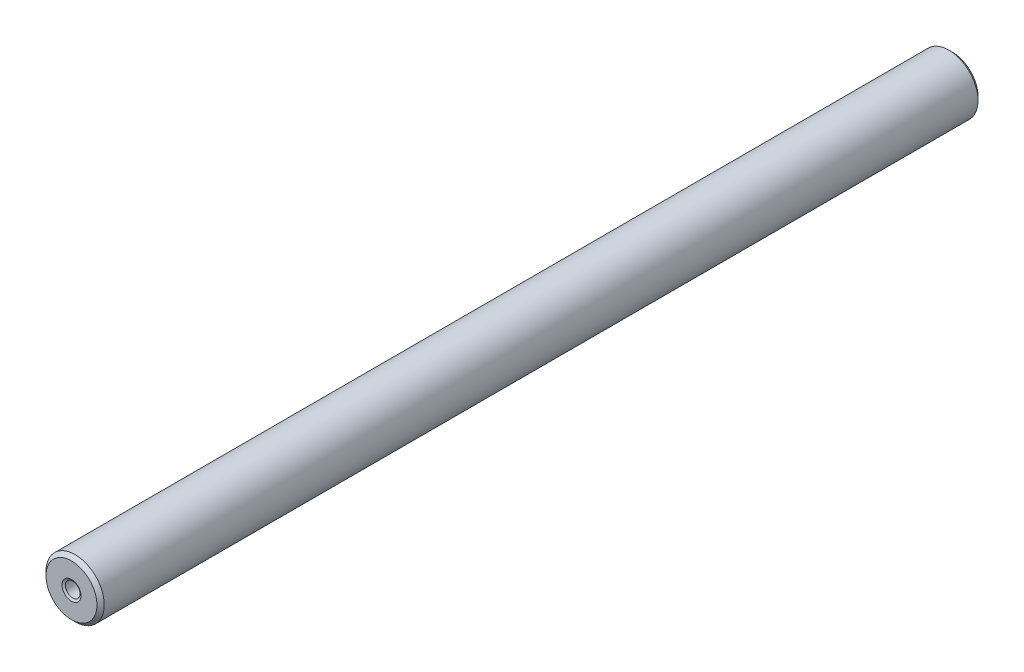
ISO-10303-21;
HEADER;
FILE_DESCRIPTION(('STEP AP214'),'2;1');
FILE_NAME('part.step','',(''),(''),'','','');
FILE_SCHEMA(('AUTOMOTIVE_DESIGN { 1 0 10303 214 1 1 1 1 }'));
ENDSEC;
DATA;
#1=APPLICATION_CONTEXT('core data for automotive mechanical design processes');
#2=APPLICATION_PROTOCOL_DEFINITION('international standard','automotive_design',2000,#1);
#3=PRODUCT_CONTEXT('',#1,'mechanical');
#4=PRODUCT('Part','Part','',(#3));
#5=PRODUCT_RELATED_PRODUCT_CATEGORY('part','',(#4));
#6=PRODUCT_DEFINITION_FORMATION('','',#4);
#7=PRODUCT_DEFINITION_CONTEXT('part definition',#1,'design');
#8=PRODUCT_DEFINITION('design','',#6,#7);
#9=PRODUCT_DEFINITION_SHAPE('','',#8);
#10=(LENGTH_UNIT() NAMED_UNIT(*) SI_UNIT(.MILLI.,.METRE.));
#11=(NAMED_UNIT(*) PLANE_ANGLE_UNIT() SI_UNIT($,.RADIAN.));
#12=(NAMED_UNIT(*) SI_UNIT($,.STERADIAN.) SOLID_ANGLE_UNIT());
#13=UNCERTAINTY_MEASURE_WITH_UNIT(LENGTH_MEASURE(1.E-05),#10,'distance_accuracy_value','');
#14=(GEOMETRIC_REPRESENTATION_CONTEXT(3) GLOBAL_UNCERTAINTY_ASSIGNED_CONTEXT((#13)) GLOBAL_UNIT_ASSIGNED_CONTEXT((#10,
#11,#12)) REPRESENTATION_CONTEXT('',''));
#15=CARTESIAN_POINT('',(0.,0.,0.));
#16=DIRECTION('',(0.,0.,1.));
#17=DIRECTION('',(1.,0.,0.));
#18=AXIS2_PLACEMENT_3D('',#15,#16,#17);
#19=CARTESIAN_POINT('',(0.,0.,119.));
#20=DIRECTION('',(0.,0.,1.));
#21=DIRECTION('',(1.,0.,0.));
#22=AXIS2_PLACEMENT_3D('',#19,#20,#21);
#23=CYLINDRICAL_SURFACE('',#22,1.);
#24=CARTESIAN_POINT('',(0.,0.,1.8267949192431));
#25=DIRECTION('',(0.,0.,1.));
#26=DIRECTION('',(1.,0.,0.));
#27=AXIS2_PLACEMENT_3D('',#24,#25,#26);
#28=CIRCLE('',#27,1.);
#29=CARTESIAN_POINT('',(1.,0.,1.8267949192431));
#30=VERTEX_POINT('',#29);
#31=EDGE_CURVE('E56',#30,#30,#28,.T.);
#32=ORIENTED_EDGE('',*,*,#31,.T.);
#33=EDGE_LOOP('',(#32));
#34=FACE_BOUND('',#33,.T.);
#35=CARTESIAN_POINT('',(0.,0.,0.299999999999981));
#36=DIRECTION('',(0.,0.,1.));
#37=DIRECTION('',(1.,0.,0.));
#38=AXIS2_PLACEMENT_3D('',#35,#36,#37);
#39=CIRCLE('',#38,1.);
#40=CARTESIAN_POINT('',(1.,0.,0.299999999999981));
#41=VERTEX_POINT('',#40);
#42=EDGE_CURVE('E59',#41,#41,#39,.F.);
#43=ORIENTED_EDGE('',*,*,#42,.T.);
#44=EDGE_LOOP('',(#43));
#45=FACE_BOUND('',#44,.T.);
#46=ADVANCED_FACE('F30',(#34,#45),#23,.F.);
#47=CARTESIAN_POINT('',(-1.,0.,0.));
#48=DIRECTION('',(0.,0.,1.));
#49=DIRECTION('',(1.,0.,0.));
#50=AXIS2_PLACEMENT_3D('',#47,#48,#49);
#51=PLANE('',#50);
#52=CARTESIAN_POINT('',(0.,0.,0.));
#53=DIRECTION('',(0.,0.,1.));
#54=DIRECTION('',(1.,0.,0.));
#55=AXIS2_PLACEMENT_3D('',#52,#53,#54);
#56=CIRCLE('',#55,1.17320508075687);
#57=CARTESIAN_POINT('',(1.17320508075687,0.,0.));
#58=VERTEX_POINT('',#57);
#59=EDGE_CURVE('E50',#58,#58,#56,.T.);
#60=ORIENTED_EDGE('',*,*,#59,.T.);
#61=EDGE_LOOP('',(#60));
#62=FACE_BOUND('',#61,.T.);
#63=CARTESIAN_POINT('',(0.,0.,0.));
#64=DIRECTION('',(0.,0.,1.));
#65=DIRECTION('',(1.,0.,0.));
#66=AXIS2_PLACEMENT_3D('',#63,#64,#65);
#67=CIRCLE('',#66,3.50000000000002);
#68=CARTESIAN_POINT('',(3.50000000000002,0.,0.));
#69=VERTEX_POINT('',#68);
#70=EDGE_CURVE('E65',#69,#69,#67,.F.);
#71=ORIENTED_EDGE('',*,*,#70,.T.);
#72=EDGE_LOOP('',(#71));
#73=FACE_BOUND('',#72,.T.);
#74=ADVANCED_FACE('F95',(#62,#73),#51,.F.);
#75=CARTESIAN_POINT('',(0.,0.,119.));
#76=DIRECTION('',(0.,0.,1.));
#77=DIRECTION('',(1.,0.,0.));
#78=AXIS2_PLACEMENT_3D('',#75,#76,#77);
#79=CYLINDRICAL_SURFACE('',#78,4.);
#80=CARTESIAN_POINT('',(0.,0.,0.499999999999973));
#81=DIRECTION('',(0.,0.,1.));
#82=DIRECTION('',(1.,0.,0.));
#83=AXIS2_PLACEMENT_3D('',#80,#81,#82);
#84=CIRCLE('',#83,4.);
#85=CARTESIAN_POINT('',(4.,0.,0.499999999999972));
#86=VERTEX_POINT('',#85);
#87=EDGE_CURVE('E68',#86,#86,#84,.T.);
#88=ORIENTED_EDGE('',*,*,#87,.T.);
#89=EDGE_LOOP('',(#88));
#90=FACE_BOUND('',#89,.T.);
#91=CARTESIAN_POINT('',(0.,0.,120.5));
#92=DIRECTION('',(0.,0.,-1.));
#93=DIRECTION('',(-1.,0.,0.));
#94=AXIS2_PLACEMENT_3D('',#91,#92,#93);
#95=CIRCLE('',#94,4.);
#96=CARTESIAN_POINT('',(-3.99999999999999,0.,120.5));
#97=VERTEX_POINT('',#96);
#98=EDGE_CURVE('E71',#97,#97,#95,.T.);
#99=ORIENTED_EDGE('',*,*,#98,.T.);
#100=EDGE_LOOP('',(#99));
#101=FACE_BOUND('',#100,.T.);
#102=ADVANCED_FACE('F75',(#90,#101),#79,.T.);
#103=CARTESIAN_POINT('',(-3.99999999999999,0.,121.));
#104=DIRECTION('',(0.,0.,-1.));
#105=DIRECTION('',(-1.,0.,0.));
#106=AXIS2_PLACEMENT_3D('',#103,#104,#105);
#107=PLANE('',#106);
#108=CARTESIAN_POINT('',(0.,0.,121.));
#109=DIRECTION('',(0.,0.,-1.));
#110=DIRECTION('',(-1.,0.,0.));
#111=AXIS2_PLACEMENT_3D('',#108,#109,#110);
#112=CIRCLE('',#111,1.30000000000004);
#113=CARTESIAN_POINT('',(-1.30000000000002,0.,121.));
#114=VERTEX_POINT('',#113);
#115=EDGE_CURVE('E10',#114,#114,#112,.T.);
#116=ORIENTED_EDGE('',*,*,#115,.T.);
#117=EDGE_LOOP('',(#116));
#118=FACE_BOUND('',#117,.T.);
#119=CARTESIAN_POINT('',(0.,0.,121.));
#120=DIRECTION('',(0.,0.,-1.));
#121=DIRECTION('',(-1.,0.,0.));
#122=AXIS2_PLACEMENT_3D('',#119,#120,#121);
#123=CIRCLE('',#122,3.50000000000003);
#124=CARTESIAN_POINT('',(-3.50000000000002,0.,121.));
#125=VERTEX_POINT('',#124);
#126=EDGE_CURVE('E62',#125,#125,#123,.F.);
#127=ORIENTED_EDGE('',*,*,#126,.T.);
#128=EDGE_LOOP('',(#127));
#129=FACE_BOUND('',#128,.T.);
#130=ADVANCED_FACE('F85',(#118,#129),#107,.F.);
#131=CARTESIAN_POINT('',(0.,0.,119.));
#132=DIRECTION('',(0.,0.,1.));
#133=DIRECTION('',(1.,0.,0.));
#134=AXIS2_PLACEMENT_3D('',#131,#132,#133);
#135=CYLINDRICAL_SURFACE('',#134,1.);
#136=CARTESIAN_POINT('',(0.,0.,119.3));
#137=DIRECTION('',(0.,0.,-1.));
#138=DIRECTION('',(-1.,0.,0.));
#139=AXIS2_PLACEMENT_3D('',#136,#137,#138);
#140=CIRCLE('',#139,1.);
#141=CARTESIAN_POINT('',(-0.999999999999985,0.,119.3));
#142=VERTEX_POINT('',#141);
#143=EDGE_CURVE('E37',#142,#142,#140,.T.);
#144=ORIENTED_EDGE('',*,*,#143,.T.);
#145=EDGE_LOOP('',(#144));
#146=FACE_BOUND('',#145,.T.);
#147=CARTESIAN_POINT('',(0.,0.,120.826794919243));
#148=DIRECTION('',(0.,0.,-1.));
#149=DIRECTION('',(-1.,0.,0.));
#150=AXIS2_PLACEMENT_3D('',#147,#148,#149);
#151=CIRCLE('',#150,1.);
#152=CARTESIAN_POINT('',(-0.999999999999985,0.,120.826794919243));
#153=VERTEX_POINT('',#152);
#154=EDGE_CURVE('E41',#153,#153,#151,.F.);
#155=ORIENTED_EDGE('',*,*,#154,.T.);
#156=EDGE_LOOP('',(#155));
#157=FACE_BOUND('',#156,.T.);
#158=ADVANCED_FACE('F87',(#146,#157),#135,.F.);
#159=CARTESIAN_POINT('',(0.,0.,119.));
#160=DIRECTION('',(0.,0.,-1.));
#161=DIRECTION('',(-1.,0.,0.));
#162=AXIS2_PLACEMENT_3D('',#159,#160,#161);
#163=PLANE('',#162);
#164=CARTESIAN_POINT('',(0.,0.,119.));
#165=DIRECTION('',(0.,0.,-1.));
#166=DIRECTION('',(-1.,0.,0.));
#167=AXIS2_PLACEMENT_3D('',#164,#165,#166);
#168=CIRCLE('',#167,0.826794919243167);
#169=CARTESIAN_POINT('',(-0.826794919243152,0.,119.));
#170=VERTEX_POINT('',#169);
#171=EDGE_CURVE('E45',#170,#170,#168,.F.);
#172=ORIENTED_EDGE('',*,*,#171,.T.);
#173=EDGE_LOOP('',(#172));
#174=FACE_BOUND('',#173,.T.);
#175=ADVANCED_FACE('F93',(#174),#163,.F.);
#176=CARTESIAN_POINT('',(0.,0.,2.));
#177=DIRECTION('',(0.,0.,1.));
#178=DIRECTION('',(1.,0.,0.));
#179=AXIS2_PLACEMENT_3D('',#176,#177,#178);
#180=PLANE('',#179);
#181=CARTESIAN_POINT('',(0.,0.,2.));
#182=DIRECTION('',(0.,0.,1.));
#183=DIRECTION('',(1.,0.,0.));
#184=AXIS2_PLACEMENT_3D('',#181,#182,#183);
#185=CIRCLE('',#184,0.700000000000009);
#186=CARTESIAN_POINT('',(0.700000000000009,0.,2.));
#187=VERTEX_POINT('',#186);
#188=EDGE_CURVE('E53',#187,#187,#185,.F.);
#189=ORIENTED_EDGE('',*,*,#188,.T.);
#190=EDGE_LOOP('',(#189));
#191=FACE_BOUND('',#190,.T.);
#192=ADVANCED_FACE('F109',(#191),#180,.F.);
#193=CARTESIAN_POINT('',(0.,0.,0.499999999999973));
#194=DIRECTION('',(0.,0.,1.));
#195=DIRECTION('',(1.,0.,0.));
#196=AXIS2_PLACEMENT_3D('',#193,#194,#195);
#197=CONICAL_SURFACE('',#196,4.,0.78539816339746);
#198=ORIENTED_EDGE('',*,*,#70,.F.);
#199=EDGE_LOOP('',(#198));
#200=FACE_BOUND('',#199,.T.);
#201=ORIENTED_EDGE('',*,*,#87,.F.);
#202=EDGE_LOOP('',(#201));
#203=FACE_BOUND('',#202,.T.);
#204=ADVANCED_FACE('F81',(#200,#203),#197,.T.);
#205=CARTESIAN_POINT('',(0.,0.,121.));
#206=DIRECTION('',(0.,0.,-1.));
#207=DIRECTION('',(-1.,0.,0.));
#208=AXIS2_PLACEMENT_3D('',#205,#206,#207);
#209=CONICAL_SURFACE('',#208,3.50000000000003,0.785398163397445);
#210=ORIENTED_EDGE('',*,*,#98,.F.);
#211=EDGE_LOOP('',(#210));
#212=FACE_BOUND('',#211,.T.);
#213=ORIENTED_EDGE('',*,*,#126,.F.);
#214=EDGE_LOOP('',(#213));
#215=FACE_BOUND('',#214,.T.);
#216=ADVANCED_FACE('F77',(#212,#215),#209,.T.);
#217=CARTESIAN_POINT('',(0.,0.,1.8267949192431));
#218=DIRECTION('',(0.,0.,-1.));
#219=DIRECTION('',(-1.,0.,0.));
#220=AXIS2_PLACEMENT_3D('',#217,#218,#219);
#221=CONICAL_SURFACE('',#220,1.,1.04719755119657);
#222=ORIENTED_EDGE('',*,*,#188,.F.);
#223=EDGE_LOOP('',(#222));
#224=FACE_BOUND('',#223,.T.);
#225=ORIENTED_EDGE('',*,*,#31,.F.);
#226=EDGE_LOOP('',(#225));
#227=FACE_BOUND('',#226,.T.);
#228=ADVANCED_FACE('F80',(#224,#227),#221,.F.);
#229=CARTESIAN_POINT('',(0.,0.,0.));
#230=DIRECTION('',(0.,0.,-1.));
#231=DIRECTION('',(-1.,0.,0.));
#232=AXIS2_PLACEMENT_3D('',#229,#230,#231);
#233=CONICAL_SURFACE('',#232,1.17320508075687,0.523598775598282);
#234=ORIENTED_EDGE('',*,*,#42,.F.);
#235=EDGE_LOOP('',(#234));
#236=FACE_BOUND('',#235,.T.);
#237=ORIENTED_EDGE('',*,*,#59,.F.);
#238=EDGE_LOOP('',(#237));
#239=FACE_BOUND('',#238,.T.);
#240=ADVANCED_FACE('F114',(#236,#239),#233,.F.);
#241=CARTESIAN_POINT('',(0.,0.,119.));
#242=DIRECTION('',(0.,0.,1.));
#243=DIRECTION('',(1.,0.,0.));
#244=AXIS2_PLACEMENT_3D('',#241,#242,#243);
#245=CONICAL_SURFACE('',#244,0.826794919243167,0.523598775598311);
#246=ORIENTED_EDGE('',*,*,#143,.F.);
#247=EDGE_LOOP('',(#246));
#248=FACE_BOUND('',#247,.T.);
#249=ORIENTED_EDGE('',*,*,#171,.F.);
#250=EDGE_LOOP('',(#249));
#251=FACE_BOUND('',#250,.T.);
#252=ADVANCED_FACE('F117',(#248,#251),#245,.F.);
#253=CARTESIAN_POINT('',(0.,0.,120.826794919243));
#254=DIRECTION('',(0.,0.,1.));
#255=DIRECTION('',(1.,0.,0.));
#256=AXIS2_PLACEMENT_3D('',#253,#254,#255);
#257=CONICAL_SURFACE('',#256,1.,1.04719755119659);
#258=ORIENTED_EDGE('',*,*,#115,.F.);
#259=EDGE_LOOP('',(#258));
#260=FACE_BOUND('',#259,.T.);
#261=ORIENTED_EDGE('',*,*,#154,.F.);
#262=EDGE_LOOP('',(#261));
#263=FACE_BOUND('',#262,.T.);
#264=ADVANCED_FACE('F32',(#260,#263),#257,.F.);
#265=CLOSED_SHELL('',(#46,#74,#102,#130,#158,#175,#192,#204,#216,#228,#240,#252,#264));
#266=MANIFOLD_SOLID_BREP('B2',#265);
#267=ADVANCED_BREP_SHAPE_REPRESENTATION('',(#18,#266),#14);
#268=SHAPE_DEFINITION_REPRESENTATION(#9,#267);
ENDSEC;
END-ISO-10303-21;
